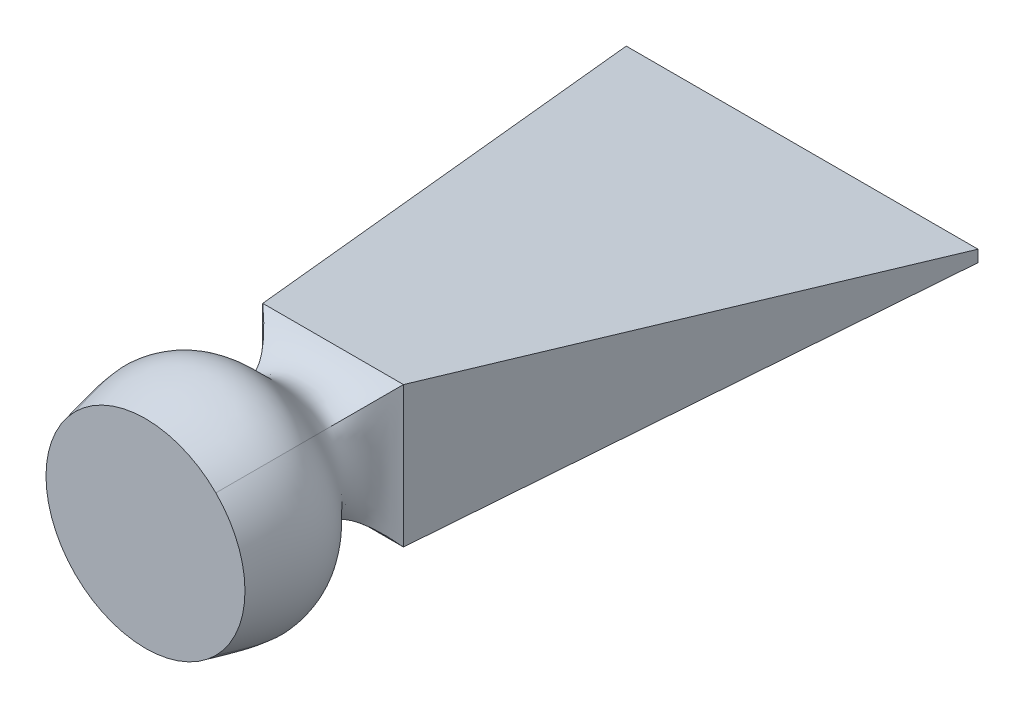
ISO-10303-21;
HEADER;
FILE_DESCRIPTION(('STEP AP214'),'2;1');
FILE_NAME('part.step','',(''),(''),'','','');
FILE_SCHEMA(('AUTOMOTIVE_DESIGN { 1 0 10303 214 1 1 1 1 }'));
ENDSEC;
DATA;
#1=APPLICATION_CONTEXT('core data for automotive mechanical design processes');
#2=APPLICATION_PROTOCOL_DEFINITION('international standard','automotive_design',2000,#1);
#3=PRODUCT_CONTEXT('',#1,'mechanical');
#4=PRODUCT('Part','Part','',(#3));
#5=PRODUCT_RELATED_PRODUCT_CATEGORY('part','',(#4));
#6=PRODUCT_DEFINITION_FORMATION('','',#4);
#7=PRODUCT_DEFINITION_CONTEXT('part definition',#1,'design');
#8=PRODUCT_DEFINITION('design','',#6,#7);
#9=PRODUCT_DEFINITION_SHAPE('','',#8);
#10=(LENGTH_UNIT() NAMED_UNIT(*) SI_UNIT(.MILLI.,.METRE.));
#11=(NAMED_UNIT(*) PLANE_ANGLE_UNIT() SI_UNIT($,.RADIAN.));
#12=(NAMED_UNIT(*) SI_UNIT($,.STERADIAN.) SOLID_ANGLE_UNIT());
#13=UNCERTAINTY_MEASURE_WITH_UNIT(LENGTH_MEASURE(1.E-05),#10,'distance_accuracy_value','');
#14=(GEOMETRIC_REPRESENTATION_CONTEXT(3) GLOBAL_UNCERTAINTY_ASSIGNED_CONTEXT((#13)) GLOBAL_UNIT_ASSIGNED_CONTEXT((#10,
#11,#12)) REPRESENTATION_CONTEXT('',''));
#15=CARTESIAN_POINT('',(0.,0.,0.));
#16=DIRECTION('',(0.,0.,1.));
#17=DIRECTION('',(1.,0.,0.));
#18=AXIS2_PLACEMENT_3D('',#15,#16,#17);
#19=CARTESIAN_POINT('',(0.,0.,80.));
#20=DIRECTION('',(0.,0.,1.));
#21=DIRECTION('',(1.,0.,0.));
#22=AXIS2_PLACEMENT_3D('',#19,#20,#21);
#23=PLANE('',#22);
#24=CARTESIAN_POINT('',(0.,0.,80.));
#25=DIRECTION('',(0.,0.,1.));
#26=DIRECTION('',(1.,0.,0.));
#27=AXIS2_PLACEMENT_3D('',#24,#25,#26);
#28=CIRCLE('',#27,42.4264068711928);
#29=CARTESIAN_POINT('',(30.,30.,80.));
#30=VERTEX_POINT('',#29);
#31=CARTESIAN_POINT('',(-30.,30.,80.));
#32=VERTEX_POINT('',#31);
#33=EDGE_CURVE('E12',#30,#32,#28,.T.);
#34=ORIENTED_EDGE('',*,*,#33,.T.);
#35=CARTESIAN_POINT('',(-30.,-30.,80.));
#36=VERTEX_POINT('',#35);
#37=EDGE_CURVE('E88',#32,#36,#28,.T.);
#38=ORIENTED_EDGE('',*,*,#37,.T.);
#39=CARTESIAN_POINT('',(30.,-30.,80.));
#40=VERTEX_POINT('',#39);
#41=EDGE_CURVE('E225',#36,#40,#28,.T.);
#42=ORIENTED_EDGE('',*,*,#41,.T.);
#43=EDGE_CURVE('E241',#40,#30,#28,.T.);
#44=ORIENTED_EDGE('',*,*,#43,.T.);
#45=EDGE_LOOP('',(#34,#38,#42,#44));
#46=FACE_BOUND('',#45,.T.);
#47=ADVANCED_FACE('F77',(#46),#23,.T.);
#48=CARTESIAN_POINT('',(-30.,30.,0.));
#49=CARTESIAN_POINT('',(-21.7851130197758,21.7851130197758,6.66666666666667));
#50=CARTESIAN_POINT('',(-11.5817366130115,11.5817366130115,21.8643607646519));
#51=CARTESIAN_POINT('',(-37.8648523900215,37.8648523900215,41.334555569998));
#52=CARTESIAN_POINT('',(-32.5252749313088,32.5252749313088,65.6294242589319));
#53=CARTESIAN_POINT('',(-30.,30.,80.));
#54=CARTESIAN_POINT('',(-30.,10.,0.));
#55=CARTESIAN_POINT('',(-21.7851130197758,7.26170433992526,6.66666666666667));
#56=CARTESIAN_POINT('',(-24.1364771472779,6.4709033782018,21.8643607646519));
#57=CARTESIAN_POINT('',(-56.2835095179051,16.4511408182332,41.334555569998));
#58=CARTESIAN_POINT('',(-49.0827252290018,14.2843080127433,65.6294242589319));
#59=CARTESIAN_POINT('',(-46.557450297693,13.442549702307,80.));
#60=CARTESIAN_POINT('',(-30.,-10.,0.));
#61=CARTESIAN_POINT('',(-21.7851130197758,-7.26170433992526,6.66666666666667));
#62=CARTESIAN_POINT('',(-24.1364771472779,-6.47090337820179,21.8643607646519));
#63=CARTESIAN_POINT('',(-56.2835095179051,-16.4511408182332,41.334555569998));
#64=CARTESIAN_POINT('',(-49.0827252290018,-14.2843080127433,65.6294242589319));
#65=CARTESIAN_POINT('',(-46.557450297693,-13.442549702307,80.));
#66=CARTESIAN_POINT('',(-30.,-30.,0.));
#67=CARTESIAN_POINT('',(-21.7851130197758,-21.7851130197758,6.66666666666667));
#68=CARTESIAN_POINT('',(-11.5817366130115,-11.5817366130115,21.8643607646519));
#69=CARTESIAN_POINT('',(-37.8648523900215,-37.8648523900215,41.334555569998));
#70=CARTESIAN_POINT('',(-32.5252749313088,-32.5252749313088,65.6294242589319));
#71=CARTESIAN_POINT('',(-30.,-30.,80.));
#72=B_SPLINE_SURFACE_WITH_KNOTS('',3,3,((#48,#49,#50,#51,#52,#53),(#54,#55,#56,#57,#58,#59),
(#60,#61,#62,#63,#64,#65),(#66,#67,#68,#69,#70,#71)),.UNSPECIFIED.,.F.,.F.,.F.,(4,4),(4,1,1,4),
(0.,1.),(0.,0.261617247640779,0.556039992217862,1.),.UNSPECIFIED.);
#73=DIRECTION('',(0.,-1.,0.));
#74=VECTOR('',#73,1.);
#75=CARTESIAN_POINT('',(-30.,30.,0.));
#76=LINE('',#75,#74);
#77=CARTESIAN_POINT('',(-30.,30.,0.));
#78=VERTEX_POINT('',#77);
#79=CARTESIAN_POINT('',(-30.,-30.,0.));
#80=VERTEX_POINT('',#79);
#81=EDGE_CURVE('E149',#78,#80,#76,.T.);
#82=CARTESIAN_POINT('',(-30.,-30.,0.));
#83=CARTESIAN_POINT('',(-21.7851130197758,-21.7851130197758,6.66666666666667));
#84=CARTESIAN_POINT('',(-11.5817366130115,-11.5817366130115,21.8643607646519));
#85=CARTESIAN_POINT('',(-37.8648523900215,-37.8648523900215,41.334555569998));
#86=CARTESIAN_POINT('',(-32.5252749313088,-32.5252749313088,65.6294242589319));
#87=CARTESIAN_POINT('',(-30.,-30.,80.));
#88=B_SPLINE_CURVE_WITH_KNOTS('',3,(#82,#83,#84,#85,#86,#87),.UNSPECIFIED.,.F.,.F.,(4,1,1,4),
(0.,0.261617247640779,0.556039992217862,1.),.UNSPECIFIED.);
#89=EDGE_CURVE('E168',#80,#36,#88,.T.);
#90=CARTESIAN_POINT('',(-30.,30.,0.));
#91=CARTESIAN_POINT('',(-21.7851130197758,21.7851130197758,6.66666666666667));
#92=CARTESIAN_POINT('',(-11.5817366130115,11.5817366130115,21.8643607646519));
#93=CARTESIAN_POINT('',(-37.8648523900215,37.8648523900215,41.334555569998));
#94=CARTESIAN_POINT('',(-32.5252749313088,32.5252749313088,65.6294242589319));
#95=CARTESIAN_POINT('',(-30.,30.,80.));
#96=B_SPLINE_CURVE_WITH_KNOTS('',3,(#90,#91,#92,#93,#94,#95),.UNSPECIFIED.,.F.,.F.,(4,1,1,4),
(0.,0.261617247640779,0.556039992217862,1.),.UNSPECIFIED.);
#97=EDGE_CURVE('E163',#32,#78,#96,.F.);
#98=ORIENTED_EDGE('',*,*,#81,.T.);
#99=ORIENTED_EDGE('',*,*,#89,.T.);
#100=ORIENTED_EDGE('',*,*,#37,.F.);
#101=ORIENTED_EDGE('',*,*,#97,.T.);
#102=EDGE_LOOP('',(#98,#99,#100,#101));
#103=FACE_BOUND('',#102,.T.);
#104=ADVANCED_FACE('F164',(#103),#72,.T.);
#105=CARTESIAN_POINT('',(-30.,-30.,0.));
#106=CARTESIAN_POINT('',(-21.7851130197758,-21.7851130197758,6.66666666666667));
#107=CARTESIAN_POINT('',(-11.5817366130115,-11.5817366130115,21.8643607646519));
#108=CARTESIAN_POINT('',(-37.8648523900215,-37.8648523900214,41.334555569998));
#109=CARTESIAN_POINT('',(-32.5252749313088,-32.5252749313088,65.6294242589319));
#110=CARTESIAN_POINT('',(-30.,-30.,80.));
#111=CARTESIAN_POINT('',(-9.99999999999999,-30.,0.));
#112=CARTESIAN_POINT('',(-7.26170433992526,-21.7851130197758,6.66666666666666));
#113=CARTESIAN_POINT('',(-6.4709033782018,-24.1364771472779,21.8643607646519));
#114=CARTESIAN_POINT('',(-16.4511408182332,-56.2835095179051,41.334555569998));
#115=CARTESIAN_POINT('',(-14.2843080127433,-49.0827252290018,65.6294242589319));
#116=CARTESIAN_POINT('',(-13.442549702307,-46.557450297693,80.));
#117=CARTESIAN_POINT('',(10.,-30.,0.));
#118=CARTESIAN_POINT('',(7.26170433992527,-21.7851130197758,6.66666666666666));
#119=CARTESIAN_POINT('',(6.47090337820179,-24.1364771472779,21.8643607646519));
#120=CARTESIAN_POINT('',(16.4511408182332,-56.2835095179051,41.334555569998));
#121=CARTESIAN_POINT('',(14.2843080127433,-49.0827252290018,65.6294242589319));
#122=CARTESIAN_POINT('',(13.442549702307,-46.557450297693,80.));
#123=CARTESIAN_POINT('',(30.,-30.,0.));
#124=CARTESIAN_POINT('',(21.7851130197758,-21.7851130197758,6.66666666666666));
#125=CARTESIAN_POINT('',(11.5817366130115,-11.5817366130115,21.8643607646519));
#126=CARTESIAN_POINT('',(37.8648523900214,-37.8648523900215,41.334555569998));
#127=CARTESIAN_POINT('',(32.5252749313088,-32.5252749313088,65.6294242589319));
#128=CARTESIAN_POINT('',(30.,-30.,80.));
#129=B_SPLINE_SURFACE_WITH_KNOTS('',3,3,((#105,#106,#107,#108,#109,#110),(#111,#112,#113,#114,
#115,#116),(#117,#118,#119,#120,#121,#122),(#123,#124,#125,#126,#127,#128)),.UNSPECIFIED.,.F.,
.F.,.F.,(4,4),(4,1,1,4),(0.,1.),(0.,0.261617247640779,0.556039992217862,1.),.UNSPECIFIED.);
#130=DIRECTION('',(1.,0.,0.));
#131=VECTOR('',#130,1.);
#132=CARTESIAN_POINT('',(-30.,-30.,0.));
#133=LINE('',#132,#131);
#134=CARTESIAN_POINT('',(30.,-30.,0.));
#135=VERTEX_POINT('',#134);
#136=EDGE_CURVE('E159',#80,#135,#133,.T.);
#137=CARTESIAN_POINT('',(30.,-30.,0.));
#138=CARTESIAN_POINT('',(21.7851130197758,-21.7851130197758,6.66666666666666));
#139=CARTESIAN_POINT('',(11.5817366130115,-11.5817366130115,21.8643607646519));
#140=CARTESIAN_POINT('',(37.8648523900214,-37.8648523900215,41.334555569998));
#141=CARTESIAN_POINT('',(32.5252749313088,-32.5252749313088,65.6294242589319));
#142=CARTESIAN_POINT('',(30.,-30.,80.));
#143=B_SPLINE_CURVE_WITH_KNOTS('',3,(#137,#138,#139,#140,#141,#142),.UNSPECIFIED.,.F.,.F.,(4,1,
1,4),(0.,0.261617247640779,0.556039992217862,1.),.UNSPECIFIED.);
#144=EDGE_CURVE('E284',#135,#40,#143,.T.);
#145=ORIENTED_EDGE('',*,*,#136,.T.);
#146=ORIENTED_EDGE('',*,*,#144,.T.);
#147=ORIENTED_EDGE('',*,*,#41,.F.);
#148=ORIENTED_EDGE('',*,*,#89,.F.);
#149=EDGE_LOOP('',(#145,#146,#147,#148));
#150=FACE_BOUND('',#149,.T.);
#151=ADVANCED_FACE('F197',(#150),#129,.T.);
#152=CARTESIAN_POINT('',(30.,30.,0.));
#153=CARTESIAN_POINT('',(21.7851130197758,21.7851130197758,6.66666666666667));
#154=CARTESIAN_POINT('',(11.5817366130115,11.5817366130115,21.8643607646519));
#155=CARTESIAN_POINT('',(37.8648523900215,37.8648523900215,41.334555569998));
#156=CARTESIAN_POINT('',(32.5252749313088,32.5252749313088,65.6294242589319));
#157=CARTESIAN_POINT('',(30.,30.,80.));
#158=CARTESIAN_POINT('',(9.99999999999999,30.,0.));
#159=CARTESIAN_POINT('',(7.26170433992526,21.7851130197758,6.66666666666667));
#160=CARTESIAN_POINT('',(6.4709033782018,24.1364771472779,21.8643607646519));
#161=CARTESIAN_POINT('',(16.4511408182332,56.2835095179051,41.334555569998));
#162=CARTESIAN_POINT('',(14.2843080127433,49.0827252290018,65.6294242589319));
#163=CARTESIAN_POINT('',(13.442549702307,46.557450297693,80.));
#164=CARTESIAN_POINT('',(-10.,30.,0.));
#165=CARTESIAN_POINT('',(-7.26170433992527,21.7851130197758,6.66666666666667));
#166=CARTESIAN_POINT('',(-6.4709033782018,24.1364771472779,21.8643607646519));
#167=CARTESIAN_POINT('',(-16.4511408182332,56.2835095179051,41.334555569998));
#168=CARTESIAN_POINT('',(-14.2843080127433,49.0827252290018,65.6294242589319));
#169=CARTESIAN_POINT('',(-13.442549702307,46.557450297693,80.));
#170=CARTESIAN_POINT('',(-30.,30.,0.));
#171=CARTESIAN_POINT('',(-21.7851130197758,21.7851130197758,6.66666666666667));
#172=CARTESIAN_POINT('',(-11.5817366130115,11.5817366130115,21.8643607646519));
#173=CARTESIAN_POINT('',(-37.8648523900215,37.8648523900215,41.334555569998));
#174=CARTESIAN_POINT('',(-32.5252749313088,32.5252749313088,65.6294242589319));
#175=CARTESIAN_POINT('',(-30.,30.,80.));
#176=B_SPLINE_SURFACE_WITH_KNOTS('',3,3,((#152,#153,#154,#155,#156,#157),(#158,#159,#160,#161,
#162,#163),(#164,#165,#166,#167,#168,#169),(#170,#171,#172,#173,#174,#175)),.UNSPECIFIED.,.F.,
.F.,.F.,(4,4),(4,1,1,4),(0.,1.),(0.,0.261617247640779,0.556039992217862,1.),.UNSPECIFIED.);
#177=DIRECTION('',(-1.,0.,0.));
#178=VECTOR('',#177,1.);
#179=CARTESIAN_POINT('',(-30.,30.,0.));
#180=LINE('',#179,#178);
#181=CARTESIAN_POINT('',(30.,30.,0.));
#182=VERTEX_POINT('',#181);
#183=EDGE_CURVE('E136',#182,#78,#180,.T.);
#184=CARTESIAN_POINT('',(30.,30.,0.));
#185=CARTESIAN_POINT('',(21.7851130197758,21.7851130197758,6.66666666666667));
#186=CARTESIAN_POINT('',(11.5817366130115,11.5817366130115,21.8643607646519));
#187=CARTESIAN_POINT('',(37.8648523900215,37.8648523900214,41.334555569998));
#188=CARTESIAN_POINT('',(32.5252749313088,32.5252749313088,65.6294242589319));
#189=CARTESIAN_POINT('',(30.,30.,80.));
#190=B_SPLINE_CURVE_WITH_KNOTS('',3,(#184,#185,#186,#187,#188,#189),.UNSPECIFIED.,.F.,.F.,(4,1,
1,4),(0.,0.261617247640779,0.556039992217862,1.),.UNSPECIFIED.);
#191=EDGE_CURVE('E173',#182,#30,#190,.T.);
#192=ORIENTED_EDGE('',*,*,#183,.T.);
#193=ORIENTED_EDGE('',*,*,#97,.F.);
#194=ORIENTED_EDGE('',*,*,#33,.F.);
#195=ORIENTED_EDGE('',*,*,#191,.F.);
#196=EDGE_LOOP('',(#192,#193,#194,#195));
#197=FACE_BOUND('',#196,.T.);
#198=ADVANCED_FACE('F172',(#197),#176,.T.);
#199=CARTESIAN_POINT('',(30.,-30.,0.));
#200=CARTESIAN_POINT('',(21.7851130197758,-21.7851130197758,6.66666666666666));
#201=CARTESIAN_POINT('',(11.5817366130115,-11.5817366130115,21.8643607646519));
#202=CARTESIAN_POINT('',(37.8648523900214,-37.8648523900215,41.334555569998));
#203=CARTESIAN_POINT('',(32.5252749313088,-32.5252749313088,65.6294242589319));
#204=CARTESIAN_POINT('',(30.,-30.,80.));
#205=CARTESIAN_POINT('',(30.,-10.,0.));
#206=CARTESIAN_POINT('',(21.7851130197758,-7.26170433992527,6.66666666666666));
#207=CARTESIAN_POINT('',(24.1364771472779,-6.4709033782018,21.8643607646519));
#208=CARTESIAN_POINT('',(56.2835095179051,-16.4511408182332,41.334555569998));
#209=CARTESIAN_POINT('',(49.0827252290018,-14.2843080127433,65.6294242589319));
#210=CARTESIAN_POINT('',(46.557450297693,-13.442549702307,80.));
#211=CARTESIAN_POINT('',(30.,10.,0.));
#212=CARTESIAN_POINT('',(21.7851130197758,7.26170433992526,6.66666666666666));
#213=CARTESIAN_POINT('',(24.1364771472779,6.47090337820179,21.8643607646519));
#214=CARTESIAN_POINT('',(56.2835095179051,16.4511408182332,41.334555569998));
#215=CARTESIAN_POINT('',(49.0827252290018,14.2843080127433,65.6294242589319));
#216=CARTESIAN_POINT('',(46.557450297693,13.442549702307,80.));
#217=CARTESIAN_POINT('',(30.,30.,0.));
#218=CARTESIAN_POINT('',(21.7851130197758,21.7851130197758,6.66666666666667));
#219=CARTESIAN_POINT('',(11.5817366130115,11.5817366130115,21.8643607646519));
#220=CARTESIAN_POINT('',(37.8648523900215,37.8648523900214,41.334555569998));
#221=CARTESIAN_POINT('',(32.5252749313088,32.5252749313088,65.6294242589319));
#222=CARTESIAN_POINT('',(30.,30.,80.));
#223=B_SPLINE_SURFACE_WITH_KNOTS('',3,3,((#199,#200,#201,#202,#203,#204),(#205,#206,#207,#208,
#209,#210),(#211,#212,#213,#214,#215,#216),(#217,#218,#219,#220,#221,#222)),.UNSPECIFIED.,.F.,
.F.,.F.,(4,4),(4,1,1,4),(0.,1.),(0.,0.261617247640779,0.556039992217862,1.),.UNSPECIFIED.);
#224=DIRECTION('',(0.,1.,0.));
#225=VECTOR('',#224,1.);
#226=CARTESIAN_POINT('',(30.,30.,0.));
#227=LINE('',#226,#225);
#228=EDGE_CURVE('E81',#135,#182,#227,.T.);
#229=ORIENTED_EDGE('',*,*,#228,.T.);
#230=ORIENTED_EDGE('',*,*,#191,.T.);
#231=ORIENTED_EDGE('',*,*,#43,.F.);
#232=ORIENTED_EDGE('',*,*,#144,.F.);
#233=EDGE_LOOP('',(#229,#230,#231,#232));
#234=FACE_BOUND('',#233,.T.);
#235=ADVANCED_FACE('F196',(#234),#223,.T.);
#236=CARTESIAN_POINT('',(0.,0.,-200.));
#237=DIRECTION('',(0.,0.,-1.));
#238=DIRECTION('',(-1.,0.,0.));
#239=AXIS2_PLACEMENT_3D('',#236,#237,#238);
#240=PLANE('',#239);
#241=DIRECTION('',(0.,1.,0.));
#242=VECTOR('',#241,1.);
#243=CARTESIAN_POINT('',(75.,2.5,-200.));
#244=LINE('',#243,#242);
#245=CARTESIAN_POINT('',(75.,-2.5,-200.));
#246=VERTEX_POINT('',#245);
#247=CARTESIAN_POINT('',(75.,2.5,-200.));
#248=VERTEX_POINT('',#247);
#249=EDGE_CURVE('E144',#246,#248,#244,.T.);
#250=ORIENTED_EDGE('',*,*,#249,.F.);
#251=DIRECTION('',(1.,0.,0.));
#252=VECTOR('',#251,1.);
#253=CARTESIAN_POINT('',(75.,-2.5,-200.));
#254=LINE('',#253,#252);
#255=CARTESIAN_POINT('',(-75.,-2.50000000000001,-200.));
#256=VERTEX_POINT('',#255);
#257=EDGE_CURVE('E471',#256,#246,#254,.T.);
#258=ORIENTED_EDGE('',*,*,#257,.F.);
#259=DIRECTION('',(0.,-1.,0.));
#260=VECTOR('',#259,1.);
#261=CARTESIAN_POINT('',(-75.,2.49999999999999,-200.));
#262=LINE('',#261,#260);
#263=CARTESIAN_POINT('',(-75.,2.49999999999999,-200.));
#264=VERTEX_POINT('',#263);
#265=EDGE_CURVE('E456',#264,#256,#262,.T.);
#266=ORIENTED_EDGE('',*,*,#265,.F.);
#267=DIRECTION('',(-1.,0.,0.));
#268=VECTOR('',#267,1.);
#269=CARTESIAN_POINT('',(75.,2.5,-200.));
#270=LINE('',#269,#268);
#271=EDGE_CURVE('E139',#248,#264,#270,.T.);
#272=ORIENTED_EDGE('',*,*,#271,.F.);
#273=EDGE_LOOP('',(#250,#258,#266,#272));
#274=FACE_BOUND('',#273,.T.);
#275=ADVANCED_FACE('F321',(#274),#240,.T.);
#276=CARTESIAN_POINT('',(28.5544318857823,0.,6.42474717430102));
#277=DIRECTION('',(0.975609756097561,0.,0.219512195121951));
#278=DIRECTION('',(0.219512195121951,0.,-0.975609756097561));
#279=AXIS2_PLACEMENT_3D('',#276,#277,#278);
#280=PLANE('',#279);
#281=DIRECTION('',(0.217563370783763,0.132955393256744,-0.966948314594504));
#282=VECTOR('',#281,1.);
#283=CARTESIAN_POINT('',(30.,-30.,0.));
#284=LINE('',#283,#282);
#285=EDGE_CURVE('E496',#135,#246,#284,.T.);
#286=ORIENTED_EDGE('',*,*,#285,.T.);
#287=ORIENTED_EDGE('',*,*,#249,.T.);
#288=DIRECTION('',(0.217563370783763,-0.132955393256744,-0.966948314594504));
#289=VECTOR('',#288,1.);
#290=CARTESIAN_POINT('',(30.,30.,0.));
#291=LINE('',#290,#289);
#292=EDGE_CURVE('E493',#182,#248,#291,.T.);
#293=ORIENTED_EDGE('',*,*,#292,.F.);
#294=ORIENTED_EDGE('',*,*,#228,.F.);
#295=EDGE_LOOP('',(#286,#287,#293,#294));
#296=FACE_BOUND('',#295,.T.);
#297=ADVANCED_FACE('F395',(#296),#280,.T.);
#298=CARTESIAN_POINT('',(0.,29.4433369115166,-4.04845882533354));
#299=DIRECTION('',(0.,0.990678839845296,-0.136218340478728));
#300=DIRECTION('',(0.,0.136218340478728,0.990678839845296));
#301=AXIS2_PLACEMENT_3D('',#298,#299,#300);
#302=PLANE('',#301);
#303=ORIENTED_EDGE('',*,*,#292,.T.);
#304=ORIENTED_EDGE('',*,*,#271,.T.);
#305=DIRECTION('',(-0.217563370783763,-0.132955393256744,-0.966948314594504));
#306=VECTOR('',#305,1.);
#307=CARTESIAN_POINT('',(-30.,30.,0.));
#308=LINE('',#307,#306);
#309=EDGE_CURVE('E131',#78,#264,#308,.T.);
#310=ORIENTED_EDGE('',*,*,#309,.F.);
#311=ORIENTED_EDGE('',*,*,#183,.F.);
#312=EDGE_LOOP('',(#303,#304,#310,#311));
#313=FACE_BOUND('',#312,.T.);
#314=ADVANCED_FACE('F134',(#313),#302,.T.);
#315=CARTESIAN_POINT('',(0.,-29.4433369115166,-4.04845882533354));
#316=DIRECTION('',(0.,-0.990678839845296,-0.136218340478728));
#317=DIRECTION('',(0.,0.136218340478728,-0.990678839845296));
#318=AXIS2_PLACEMENT_3D('',#315,#316,#317);
#319=PLANE('',#318);
#320=DIRECTION('',(-0.217563370783763,0.132955393256744,-0.966948314594504));
#321=VECTOR('',#320,1.);
#322=CARTESIAN_POINT('',(-30.,-30.,0.));
#323=LINE('',#322,#321);
#324=EDGE_CURVE('E145',#80,#256,#323,.T.);
#325=ORIENTED_EDGE('',*,*,#324,.T.);
#326=ORIENTED_EDGE('',*,*,#257,.T.);
#327=ORIENTED_EDGE('',*,*,#285,.F.);
#328=ORIENTED_EDGE('',*,*,#136,.F.);
#329=EDGE_LOOP('',(#325,#326,#327,#328));
#330=FACE_BOUND('',#329,.T.);
#331=ADVANCED_FACE('F412',(#330),#319,.T.);
#332=CARTESIAN_POINT('',(-28.5544318857823,0.,6.42474717430101));
#333=DIRECTION('',(-0.975609756097561,0.,0.219512195121951));
#334=DIRECTION('',(0.219512195121951,0.,0.975609756097561));
#335=AXIS2_PLACEMENT_3D('',#332,#333,#334);
#336=PLANE('',#335);
#337=ORIENTED_EDGE('',*,*,#309,.T.);
#338=ORIENTED_EDGE('',*,*,#265,.T.);
#339=ORIENTED_EDGE('',*,*,#324,.F.);
#340=ORIENTED_EDGE('',*,*,#81,.F.);
#341=EDGE_LOOP('',(#337,#338,#339,#340));
#342=FACE_BOUND('',#341,.T.);
#343=ADVANCED_FACE('F152',(#342),#336,.T.);
#344=CLOSED_SHELL('',(#47,#104,#151,#198,#235,#275,#297,#314,#331,#343));
#345=MANIFOLD_SOLID_BREP('B2',#344);
#346=ADVANCED_BREP_SHAPE_REPRESENTATION('',(#18,#345),#14);
#347=SHAPE_DEFINITION_REPRESENTATION(#9,#346);
ENDSEC;
END-ISO-10303-21;
